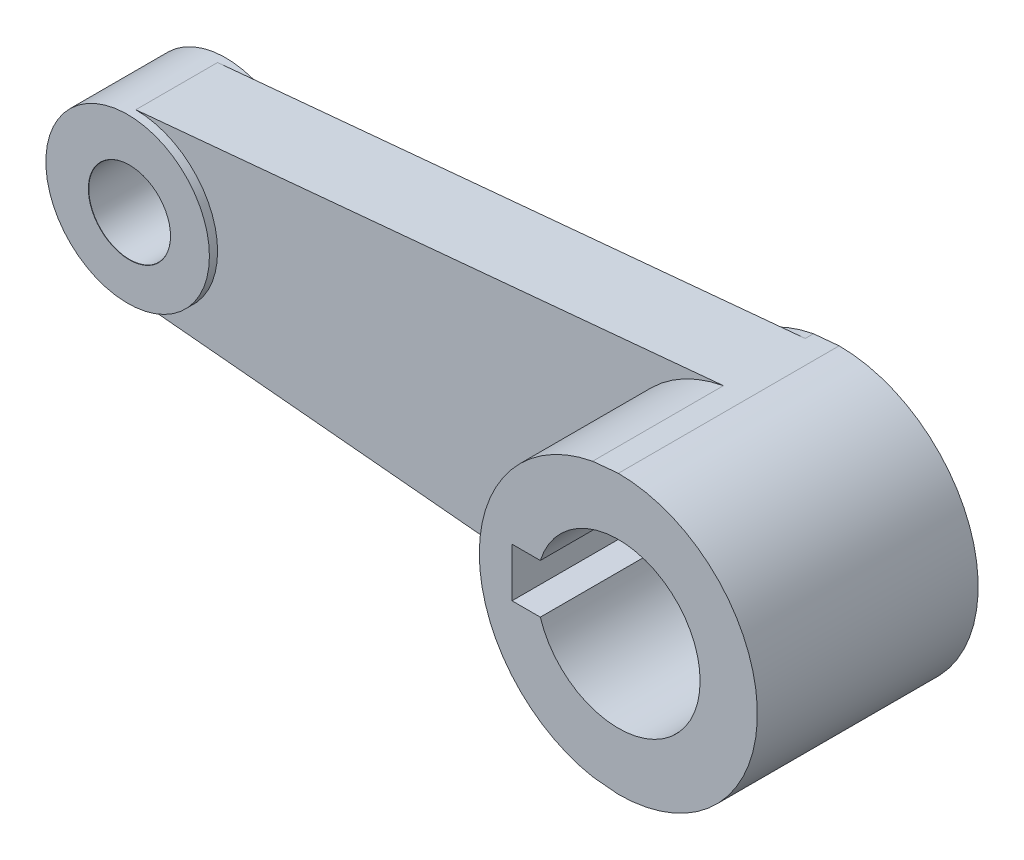
ISO-10303-21;
HEADER;
FILE_DESCRIPTION(('STEP AP214'),'2;1');
FILE_NAME('part.step','',(''),(''),'','','');
FILE_SCHEMA(('AUTOMOTIVE_DESIGN { 1 0 10303 214 1 1 1 1 }'));
ENDSEC;
DATA;
#1=APPLICATION_CONTEXT('core data for automotive mechanical design processes');
#2=APPLICATION_PROTOCOL_DEFINITION('international standard','automotive_design',2000,#1);
#3=PRODUCT_CONTEXT('',#1,'mechanical');
#4=PRODUCT('Part','Part','',(#3));
#5=PRODUCT_RELATED_PRODUCT_CATEGORY('part','',(#4));
#6=PRODUCT_DEFINITION_FORMATION('','',#4);
#7=PRODUCT_DEFINITION_CONTEXT('part definition',#1,'design');
#8=PRODUCT_DEFINITION('design','',#6,#7);
#9=PRODUCT_DEFINITION_SHAPE('','',#8);
#10=(LENGTH_UNIT() NAMED_UNIT(*) SI_UNIT(.MILLI.,.METRE.));
#11=(NAMED_UNIT(*) PLANE_ANGLE_UNIT() SI_UNIT($,.RADIAN.));
#12=(NAMED_UNIT(*) SI_UNIT($,.STERADIAN.) SOLID_ANGLE_UNIT());
#13=UNCERTAINTY_MEASURE_WITH_UNIT(LENGTH_MEASURE(1.E-05),#10,'distance_accuracy_value','');
#14=(GEOMETRIC_REPRESENTATION_CONTEXT(3) GLOBAL_UNCERTAINTY_ASSIGNED_CONTEXT((#13)) GLOBAL_UNIT_ASSIGNED_CONTEXT((#10,
#11,#12)) REPRESENTATION_CONTEXT('',''));
#15=CARTESIAN_POINT('',(0.,0.,0.));
#16=DIRECTION('',(0.,0.,1.));
#17=DIRECTION('',(1.,0.,0.));
#18=AXIS2_PLACEMENT_3D('',#15,#16,#17);
#19=CARTESIAN_POINT('',(-1.57296439901304,16.8531899894255,5.));
#20=DIRECTION('',(0.092929451601597,-0.995672695731397,0.));
#21=DIRECTION('',(0.995672695731397,0.092929451601597,0.));
#22=AXIS2_PLACEMENT_3D('',#19,#20,#21);
#23=PLANE('',#22);
#24=DIRECTION('',(-0.995672695731397,-0.092929451601597,0.));
#25=VECTOR('',#24,1.);
#26=CARTESIAN_POINT('',(-1.57296439901304,16.8531899894255,-5.));
#27=LINE('',#26,#25);
#28=CARTESIAN_POINT('',(-3.14592879802602,16.7063799788509,-5.));
#29=VERTEX_POINT('',#28);
#30=CARTESIAN_POINT('',(-75.,10.,-5.));
#31=VERTEX_POINT('',#30);
#32=EDGE_CURVE('E223',#29,#31,#27,.T.);
#33=ORIENTED_EDGE('',*,*,#32,.T.);
#34=DIRECTION('',(0.,0.,-1.));
#35=VECTOR('',#34,1.);
#36=CARTESIAN_POINT('',(-75.,10.,5.));
#37=LINE('',#36,#35);
#38=CARTESIAN_POINT('',(-75.,10.,5.));
#39=VERTEX_POINT('',#38);
#40=EDGE_CURVE('E11',#39,#31,#37,.T.);
#41=ORIENTED_EDGE('',*,*,#40,.F.);
#42=DIRECTION('',(-0.995672695731397,-0.092929451601597,0.));
#43=VECTOR('',#42,1.);
#44=CARTESIAN_POINT('',(-1.57296439901304,16.8531899894255,5.));
#45=LINE('',#44,#43);
#46=CARTESIAN_POINT('',(-3.14592879802602,16.7063799788509,5.));
#47=VERTEX_POINT('',#46);
#48=EDGE_CURVE('E212',#47,#39,#45,.T.);
#49=ORIENTED_EDGE('',*,*,#48,.F.);
#50=DIRECTION('',(0.,0.,-1.));
#51=VECTOR('',#50,1.);
#52=CARTESIAN_POINT('',(-3.14592879802602,16.7063799788509,21.));
#53=LINE('',#52,#51);
#54=CARTESIAN_POINT('',(-3.14592879802602,16.7063799788509,21.));
#55=VERTEX_POINT('',#54);
#56=EDGE_CURVE('E196',#55,#47,#53,.T.);
#57=ORIENTED_EDGE('',*,*,#56,.F.);
#58=DIRECTION('',(-0.995672695731397,-0.092929451601597,0.));
#59=VECTOR('',#58,1.);
#60=CARTESIAN_POINT('',(-1.57296439901304,16.8531899894255,21.));
#61=LINE('',#60,#59);
#62=CARTESIAN_POINT('',(0.,17.,21.));
#63=VERTEX_POINT('',#62);
#64=EDGE_CURVE('E166',#63,#55,#61,.T.);
#65=ORIENTED_EDGE('',*,*,#64,.F.);
#66=DIRECTION('',(0.,0.,-1.));
#67=VECTOR('',#66,1.);
#68=CARTESIAN_POINT('',(0.,17.,21.));
#69=LINE('',#68,#67);
#70=CARTESIAN_POINT('',(0.,17.,-6.));
#71=VERTEX_POINT('',#70);
#72=EDGE_CURVE('E140',#63,#71,#69,.T.);
#73=ORIENTED_EDGE('',*,*,#72,.T.);
#74=DIRECTION('',(-0.995672695731397,-0.092929451601597,0.));
#75=VECTOR('',#74,1.);
#76=CARTESIAN_POINT('',(-1.57296439901304,16.8531899894255,-6.));
#77=LINE('',#76,#75);
#78=CARTESIAN_POINT('',(-3.14592879802602,16.7063799788509,-6.));
#79=VERTEX_POINT('',#78);
#80=EDGE_CURVE('E183',#71,#79,#77,.T.);
#81=ORIENTED_EDGE('',*,*,#80,.T.);
#82=EDGE_CURVE('E195',#29,#79,#53,.T.);
#83=ORIENTED_EDGE('',*,*,#82,.F.);
#84=EDGE_LOOP('',(#33,#41,#49,#57,#65,#73,#81,#83));
#85=FACE_BOUND('',#84,.T.);
#86=ADVANCED_FACE('F43',(#85),#23,.F.);
#87=CARTESIAN_POINT('',(-1.57296439901304,-16.8531899894255,5.));
#88=DIRECTION('',(0.0929294516015969,0.995672695731397,0.));
#89=DIRECTION('',(-0.995672695731397,0.0929294516015969,0.));
#90=AXIS2_PLACEMENT_3D('',#87,#88,#89);
#91=PLANE('',#90);
#92=DIRECTION('',(0.995672695731397,-0.092929451601597,0.));
#93=VECTOR('',#92,1.);
#94=CARTESIAN_POINT('',(-1.57296439901304,-16.8531899894255,-5.));
#95=LINE('',#94,#93);
#96=CARTESIAN_POINT('',(-75.0000000000001,-10.,-5.));
#97=VERTEX_POINT('',#96);
#98=CARTESIAN_POINT('',(-3.14592879802602,-16.7063799788509,-5.));
#99=VERTEX_POINT('',#98);
#100=EDGE_CURVE('E213',#97,#99,#95,.T.);
#101=ORIENTED_EDGE('',*,*,#100,.T.);
#102=DIRECTION('',(0.,0.,-1.));
#103=VECTOR('',#102,1.);
#104=CARTESIAN_POINT('',(-3.14592879802602,-16.7063799788509,21.));
#105=LINE('',#104,#103);
#106=CARTESIAN_POINT('',(-3.14592879802602,-16.7063799788509,-6.));
#107=VERTEX_POINT('',#106);
#108=EDGE_CURVE('E57',#99,#107,#105,.T.);
#109=ORIENTED_EDGE('',*,*,#108,.T.);
#110=DIRECTION('',(0.995672695731397,-0.092929451601597,0.));
#111=VECTOR('',#110,1.);
#112=CARTESIAN_POINT('',(-1.57296439901304,-16.8531899894255,-6.));
#113=LINE('',#112,#111);
#114=CARTESIAN_POINT('',(0.,-17.,-6.));
#115=VERTEX_POINT('',#114);
#116=EDGE_CURVE('E157',#107,#115,#113,.T.);
#117=ORIENTED_EDGE('',*,*,#116,.T.);
#118=DIRECTION('',(0.,0.,-1.));
#119=VECTOR('',#118,1.);
#120=CARTESIAN_POINT('',(0.,-17.,21.));
#121=LINE('',#120,#119);
#122=CARTESIAN_POINT('',(0.,-17.,21.));
#123=VERTEX_POINT('',#122);
#124=EDGE_CURVE('E189',#123,#115,#121,.T.);
#125=ORIENTED_EDGE('',*,*,#124,.F.);
#126=DIRECTION('',(0.995672695731397,-0.092929451601597,0.));
#127=VECTOR('',#126,1.);
#128=CARTESIAN_POINT('',(-1.57296439901304,-16.8531899894255,21.));
#129=LINE('',#128,#127);
#130=CARTESIAN_POINT('',(-3.14592879802602,-16.7063799788509,21.));
#131=VERTEX_POINT('',#130);
#132=EDGE_CURVE('E171',#131,#123,#129,.T.);
#133=ORIENTED_EDGE('',*,*,#132,.F.);
#134=CARTESIAN_POINT('',(-3.14592879802602,-16.7063799788509,5.));
#135=VERTEX_POINT('',#134);
#136=EDGE_CURVE('E192',#131,#135,#105,.T.);
#137=ORIENTED_EDGE('',*,*,#136,.T.);
#138=DIRECTION('',(0.995672695731397,-0.092929451601597,0.));
#139=VECTOR('',#138,1.);
#140=CARTESIAN_POINT('',(-1.57296439901304,-16.8531899894255,5.));
#141=LINE('',#140,#139);
#142=CARTESIAN_POINT('',(-75.0000000000001,-10.,5.));
#143=VERTEX_POINT('',#142);
#144=EDGE_CURVE('E218',#143,#135,#141,.T.);
#145=ORIENTED_EDGE('',*,*,#144,.F.);
#146=DIRECTION('',(0.,0.,-1.));
#147=VECTOR('',#146,1.);
#148=CARTESIAN_POINT('',(-75.,-10.,5.));
#149=LINE('',#148,#147);
#150=EDGE_CURVE('E50',#143,#97,#149,.T.);
#151=ORIENTED_EDGE('',*,*,#150,.T.);
#152=EDGE_LOOP('',(#101,#109,#117,#125,#133,#137,#145,#151));
#153=FACE_BOUND('',#152,.T.);
#154=ADVANCED_FACE('F232',(#153),#91,.F.);
#155=CARTESIAN_POINT('',(0.,0.,5.));
#156=DIRECTION('',(0.,0.,1.));
#157=DIRECTION('',(1.,0.,0.));
#158=AXIS2_PLACEMENT_3D('',#155,#156,#157);
#159=PLANE('',#158);
#160=CARTESIAN_POINT('',(0.,0.,5.));
#161=DIRECTION('',(0.,0.,1.));
#162=DIRECTION('',(1.,0.,0.));
#163=AXIS2_PLACEMENT_3D('',#160,#161,#162);
#164=CIRCLE('',#163,17.);
#165=EDGE_CURVE('E210',#47,#135,#164,.T.);
#166=ORIENTED_EDGE('',*,*,#165,.F.);
#167=ORIENTED_EDGE('',*,*,#48,.T.);
#168=CARTESIAN_POINT('',(-75.,0.,5.));
#169=DIRECTION('',(0.,0.,1.));
#170=DIRECTION('',(1.,0.,0.));
#171=AXIS2_PLACEMENT_3D('',#168,#169,#170);
#172=CIRCLE('',#171,10.);
#173=EDGE_CURVE('E216',#143,#39,#172,.T.);
#174=ORIENTED_EDGE('',*,*,#173,.F.);
#175=ORIENTED_EDGE('',*,*,#144,.T.);
#176=EDGE_LOOP('',(#166,#167,#174,#175));
#177=FACE_BOUND('',#176,.T.);
#178=ADVANCED_FACE('F258',(#177),#159,.T.);
#179=CARTESIAN_POINT('',(0.,0.,-5.));
#180=DIRECTION('',(0.,0.,1.));
#181=DIRECTION('',(1.,0.,0.));
#182=AXIS2_PLACEMENT_3D('',#179,#180,#181);
#183=PLANE('',#182);
#184=CARTESIAN_POINT('',(0.,0.,-5.));
#185=DIRECTION('',(0.,0.,1.));
#186=DIRECTION('',(1.,0.,0.));
#187=AXIS2_PLACEMENT_3D('',#184,#185,#186);
#188=CIRCLE('',#187,17.);
#189=EDGE_CURVE('E207',#29,#99,#188,.T.);
#190=ORIENTED_EDGE('',*,*,#189,.T.);
#191=ORIENTED_EDGE('',*,*,#100,.F.);
#192=CARTESIAN_POINT('',(-75.,0.,-5.));
#193=DIRECTION('',(0.,0.,1.));
#194=DIRECTION('',(1.,0.,0.));
#195=AXIS2_PLACEMENT_3D('',#192,#193,#194);
#196=CIRCLE('',#195,10.);
#197=EDGE_CURVE('E225',#97,#31,#196,.T.);
#198=ORIENTED_EDGE('',*,*,#197,.T.);
#199=ORIENTED_EDGE('',*,*,#32,.F.);
#200=EDGE_LOOP('',(#190,#191,#198,#199));
#201=FACE_BOUND('',#200,.T.);
#202=ADVANCED_FACE('F235',(#201),#183,.F.);
#203=CARTESIAN_POINT('',(-75.,0.,6.));
#204=DIRECTION('',(0.,0.,-1.));
#205=DIRECTION('',(-1.,0.,0.));
#206=AXIS2_PLACEMENT_3D('',#203,#204,#205);
#207=CYLINDRICAL_SURFACE('',#206,10.);
#208=ORIENTED_EDGE('',*,*,#173,.T.);
#209=ORIENTED_EDGE('',*,*,#40,.T.);
#210=ORIENTED_EDGE('',*,*,#197,.F.);
#211=ORIENTED_EDGE('',*,*,#150,.F.);
#212=EDGE_LOOP('',(#208,#209,#210,#211));
#213=FACE_BOUND('',#212,.T.);
#214=CARTESIAN_POINT('',(-75.,0.,6.));
#215=DIRECTION('',(0.,0.,1.));
#216=DIRECTION('',(1.,0.,0.));
#217=AXIS2_PLACEMENT_3D('',#214,#215,#216);
#218=CIRCLE('',#217,10.);
#219=CARTESIAN_POINT('',(-65.,0.,6.));
#220=VERTEX_POINT('',#219);
#221=EDGE_CURVE('E204',#220,#220,#218,.T.);
#222=ORIENTED_EDGE('',*,*,#221,.F.);
#223=EDGE_LOOP('',(#222));
#224=FACE_BOUND('',#223,.T.);
#225=CARTESIAN_POINT('',(-75.,0.,-6.));
#226=DIRECTION('',(0.,0.,1.));
#227=DIRECTION('',(1.,0.,0.));
#228=AXIS2_PLACEMENT_3D('',#225,#226,#227);
#229=CIRCLE('',#228,10.);
#230=CARTESIAN_POINT('',(-65.,0.,-6.));
#231=VERTEX_POINT('',#230);
#232=EDGE_CURVE('E198',#231,#231,#229,.T.);
#233=ORIENTED_EDGE('',*,*,#232,.T.);
#234=EDGE_LOOP('',(#233));
#235=FACE_BOUND('',#234,.T.);
#236=ADVANCED_FACE('F260',(#213,#224,#235),#207,.T.);
#237=CARTESIAN_POINT('',(-75.,0.,6.));
#238=DIRECTION('',(0.,0.,1.));
#239=DIRECTION('',(1.,0.,0.));
#240=AXIS2_PLACEMENT_3D('',#237,#238,#239);
#241=PLANE('',#240);
#242=CARTESIAN_POINT('',(-74.7794194588171,-0.26573538121514,6.));
#243=DIRECTION('',(0.,0.,1.));
#244=DIRECTION('',(1.,0.,0.));
#245=AXIS2_PLACEMENT_3D('',#242,#243,#244);
#246=CIRCLE('',#245,5.025);
#247=CARTESIAN_POINT('',(-69.7544194588171,-0.26573538121514,6.));
#248=VERTEX_POINT('',#247);
#249=EDGE_CURVE('E471',#248,#248,#246,.T.);
#250=ORIENTED_EDGE('',*,*,#249,.F.);
#251=EDGE_LOOP('',(#250));
#252=FACE_BOUND('',#251,.T.);
#253=ORIENTED_EDGE('',*,*,#221,.T.);
#254=EDGE_LOOP('',(#253));
#255=FACE_BOUND('',#254,.T.);
#256=ADVANCED_FACE('F263',(#252,#255),#241,.T.);
#257=CARTESIAN_POINT('',(-75.,0.,-6.));
#258=DIRECTION('',(0.,0.,1.));
#259=DIRECTION('',(1.,0.,0.));
#260=AXIS2_PLACEMENT_3D('',#257,#258,#259);
#261=PLANE('',#260);
#262=CARTESIAN_POINT('',(-74.7794194588171,-0.26573538121514,-6.));
#263=DIRECTION('',(0.,0.,1.));
#264=DIRECTION('',(1.,0.,0.));
#265=AXIS2_PLACEMENT_3D('',#262,#263,#264);
#266=CIRCLE('',#265,5.);
#267=CARTESIAN_POINT('',(-69.7794194588171,-0.26573538121514,-6.));
#268=VERTEX_POINT('',#267);
#269=EDGE_CURVE('E161',#268,#268,#266,.T.);
#270=ORIENTED_EDGE('',*,*,#269,.T.);
#271=EDGE_LOOP('',(#270));
#272=FACE_BOUND('',#271,.T.);
#273=ORIENTED_EDGE('',*,*,#232,.F.);
#274=EDGE_LOOP('',(#273));
#275=FACE_BOUND('',#274,.T.);
#276=ADVANCED_FACE('F269',(#272,#275),#261,.F.);
#277=CARTESIAN_POINT('',(0.,0.,21.));
#278=DIRECTION('',(0.,0.,-1.));
#279=DIRECTION('',(-1.,0.,0.));
#280=AXIS2_PLACEMENT_3D('',#277,#278,#279);
#281=CYLINDRICAL_SURFACE('',#280,17.);
#282=ORIENTED_EDGE('',*,*,#108,.F.);
#283=ORIENTED_EDGE('',*,*,#189,.F.);
#284=ORIENTED_EDGE('',*,*,#82,.T.);
#285=CARTESIAN_POINT('',(0.,0.,-6.));
#286=DIRECTION('',(0.,0.,1.));
#287=DIRECTION('',(1.,0.,0.));
#288=AXIS2_PLACEMENT_3D('',#285,#286,#287);
#289=CIRCLE('',#288,17.);
#290=EDGE_CURVE('E159',#79,#107,#289,.T.);
#291=ORIENTED_EDGE('',*,*,#290,.T.);
#292=EDGE_LOOP('',(#282,#283,#284,#291));
#293=FACE_BOUND('',#292,.T.);
#294=ADVANCED_FACE('F238',(#293),#281,.T.);
#295=ORIENTED_EDGE('',*,*,#165,.T.);
#296=ORIENTED_EDGE('',*,*,#136,.F.);
#297=CARTESIAN_POINT('',(0.,0.,21.));
#298=DIRECTION('',(0.,0.,1.));
#299=DIRECTION('',(1.,0.,0.));
#300=AXIS2_PLACEMENT_3D('',#297,#298,#299);
#301=CIRCLE('',#300,17.);
#302=EDGE_CURVE('E169',#55,#131,#301,.T.);
#303=ORIENTED_EDGE('',*,*,#302,.F.);
#304=ORIENTED_EDGE('',*,*,#56,.T.);
#305=EDGE_LOOP('',(#295,#296,#303,#304));
#306=FACE_BOUND('',#305,.T.);
#307=ADVANCED_FACE('F277',(#306),#281,.T.);
#308=CARTESIAN_POINT('',(0.,0.,21.));
#309=DIRECTION('',(0.,0.,-1.));
#310=DIRECTION('',(-1.,0.,0.));
#311=AXIS2_PLACEMENT_3D('',#308,#309,#310);
#312=CYLINDRICAL_SURFACE('',#311,10.);
#313=CARTESIAN_POINT('',(0.,0.,-6.));
#314=DIRECTION('',(0.,0.,1.));
#315=DIRECTION('',(1.,0.,0.));
#316=AXIS2_PLACEMENT_3D('',#313,#314,#315);
#317=CIRCLE('',#316,10.);
#318=CARTESIAN_POINT('',(-9.53939201416946,-3.,-6.));
#319=VERTEX_POINT('',#318);
#320=CARTESIAN_POINT('',(-9.53939201416946,3.,-6.));
#321=VERTEX_POINT('',#320);
#322=EDGE_CURVE('E136',#319,#321,#317,.T.);
#323=ORIENTED_EDGE('',*,*,#322,.F.);
#324=DIRECTION('',(0.,0.,-1.));
#325=VECTOR('',#324,1.);
#326=CARTESIAN_POINT('',(-9.53939201416946,-3.,21.));
#327=LINE('',#326,#325);
#328=CARTESIAN_POINT('',(-9.53939201416946,-3.,21.));
#329=VERTEX_POINT('',#328);
#330=EDGE_CURVE('E129',#329,#319,#327,.T.);
#331=ORIENTED_EDGE('',*,*,#330,.F.);
#332=CARTESIAN_POINT('',(0.,0.,21.));
#333=DIRECTION('',(0.,0.,1.));
#334=DIRECTION('',(1.,0.,0.));
#335=AXIS2_PLACEMENT_3D('',#332,#333,#334);
#336=CIRCLE('',#335,10.);
#337=CARTESIAN_POINT('',(-9.53939201416946,3.,21.));
#338=VERTEX_POINT('',#337);
#339=EDGE_CURVE('E133',#329,#338,#336,.T.);
#340=ORIENTED_EDGE('',*,*,#339,.T.);
#341=DIRECTION('',(0.,0.,-1.));
#342=VECTOR('',#341,1.);
#343=CARTESIAN_POINT('',(-9.53939201416946,3.,21.));
#344=LINE('',#343,#342);
#345=EDGE_CURVE('E199',#338,#321,#344,.T.);
#346=ORIENTED_EDGE('',*,*,#345,.T.);
#347=EDGE_LOOP('',(#323,#331,#340,#346));
#348=FACE_BOUND('',#347,.T.);
#349=ADVANCED_FACE('F131',(#348),#312,.F.);
#350=CARTESIAN_POINT('',(0.,-3.,21.));
#351=DIRECTION('',(0.,-1.,0.));
#352=DIRECTION('',(1.,0.,0.));
#353=AXIS2_PLACEMENT_3D('',#350,#351,#352);
#354=PLANE('',#353);
#355=DIRECTION('',(-1.,0.,0.));
#356=VECTOR('',#355,1.);
#357=CARTESIAN_POINT('',(0.,-3.,-6.));
#358=LINE('',#357,#356);
#359=CARTESIAN_POINT('',(-13.,-3.,-6.));
#360=VERTEX_POINT('',#359);
#361=EDGE_CURVE('E175',#319,#360,#358,.T.);
#362=ORIENTED_EDGE('',*,*,#361,.T.);
#363=DIRECTION('',(0.,0.,-1.));
#364=VECTOR('',#363,1.);
#365=CARTESIAN_POINT('',(-13.,-3.,21.));
#366=LINE('',#365,#364);
#367=CARTESIAN_POINT('',(-13.,-3.,21.));
#368=VERTEX_POINT('',#367);
#369=EDGE_CURVE('E141',#368,#360,#366,.T.);
#370=ORIENTED_EDGE('',*,*,#369,.F.);
#371=DIRECTION('',(-1.,0.,0.));
#372=VECTOR('',#371,1.);
#373=CARTESIAN_POINT('',(0.,-3.,21.));
#374=LINE('',#373,#372);
#375=EDGE_CURVE('E144',#329,#368,#374,.T.);
#376=ORIENTED_EDGE('',*,*,#375,.F.);
#377=ORIENTED_EDGE('',*,*,#330,.T.);
#378=EDGE_LOOP('',(#362,#370,#376,#377));
#379=FACE_BOUND('',#378,.T.);
#380=ADVANCED_FACE('F145',(#379),#354,.F.);
#381=CARTESIAN_POINT('',(-13.,0.,21.));
#382=DIRECTION('',(1.,0.,0.));
#383=DIRECTION('',(0.,0.,-1.));
#384=AXIS2_PLACEMENT_3D('',#381,#382,#383);
#385=PLANE('',#384);
#386=DIRECTION('',(0.,-1.,0.));
#387=VECTOR('',#386,1.);
#388=CARTESIAN_POINT('',(-13.,0.,-6.));
#389=LINE('',#388,#387);
#390=CARTESIAN_POINT('',(-13.,3.,-6.));
#391=VERTEX_POINT('',#390);
#392=EDGE_CURVE('E177',#391,#360,#389,.T.);
#393=ORIENTED_EDGE('',*,*,#392,.F.);
#394=DIRECTION('',(0.,0.,-1.));
#395=VECTOR('',#394,1.);
#396=CARTESIAN_POINT('',(-13.,3.,21.));
#397=LINE('',#396,#395);
#398=CARTESIAN_POINT('',(-13.,3.,21.));
#399=VERTEX_POINT('',#398);
#400=EDGE_CURVE('E201',#399,#391,#397,.T.);
#401=ORIENTED_EDGE('',*,*,#400,.F.);
#402=DIRECTION('',(0.,-1.,0.));
#403=VECTOR('',#402,1.);
#404=CARTESIAN_POINT('',(-13.,0.,21.));
#405=LINE('',#404,#403);
#406=EDGE_CURVE('E149',#399,#368,#405,.T.);
#407=ORIENTED_EDGE('',*,*,#406,.T.);
#408=ORIENTED_EDGE('',*,*,#369,.T.);
#409=EDGE_LOOP('',(#393,#401,#407,#408));
#410=FACE_BOUND('',#409,.T.);
#411=ADVANCED_FACE('F371',(#410),#385,.T.);
#412=CARTESIAN_POINT('',(0.,3.,21.));
#413=DIRECTION('',(0.,-1.,0.));
#414=DIRECTION('',(0.,0.,-1.));
#415=AXIS2_PLACEMENT_3D('',#412,#413,#414);
#416=PLANE('',#415);
#417=DIRECTION('',(-1.,0.,0.));
#418=VECTOR('',#417,1.);
#419=CARTESIAN_POINT('',(0.,3.,-6.));
#420=LINE('',#419,#418);
#421=EDGE_CURVE('E180',#321,#391,#420,.T.);
#422=ORIENTED_EDGE('',*,*,#421,.F.);
#423=ORIENTED_EDGE('',*,*,#345,.F.);
#424=DIRECTION('',(-1.,0.,0.));
#425=VECTOR('',#424,1.);
#426=CARTESIAN_POINT('',(0.,3.,21.));
#427=LINE('',#426,#425);
#428=EDGE_CURVE('E154',#338,#399,#427,.T.);
#429=ORIENTED_EDGE('',*,*,#428,.T.);
#430=ORIENTED_EDGE('',*,*,#400,.T.);
#431=EDGE_LOOP('',(#422,#423,#429,#430));
#432=FACE_BOUND('',#431,.T.);
#433=ADVANCED_FACE('F363',(#432),#416,.T.);
#434=EDGE_CURVE('E155',#115,#71,#289,.T.);
#435=ORIENTED_EDGE('',*,*,#434,.T.);
#436=ORIENTED_EDGE('',*,*,#72,.F.);
#437=EDGE_CURVE('E172',#123,#63,#301,.T.);
#438=ORIENTED_EDGE('',*,*,#437,.F.);
#439=ORIENTED_EDGE('',*,*,#124,.T.);
#440=EDGE_LOOP('',(#435,#436,#438,#439));
#441=FACE_BOUND('',#440,.T.);
#442=ADVANCED_FACE('F252',(#441),#281,.T.);
#443=CARTESIAN_POINT('',(0.,0.,21.));
#444=DIRECTION('',(0.,0.,1.));
#445=DIRECTION('',(1.,0.,0.));
#446=AXIS2_PLACEMENT_3D('',#443,#444,#445);
#447=PLANE('',#446);
#448=ORIENTED_EDGE('',*,*,#339,.F.);
#449=ORIENTED_EDGE('',*,*,#375,.T.);
#450=ORIENTED_EDGE('',*,*,#406,.F.);
#451=ORIENTED_EDGE('',*,*,#428,.F.);
#452=EDGE_LOOP('',(#448,#449,#450,#451));
#453=FACE_BOUND('',#452,.T.);
#454=ORIENTED_EDGE('',*,*,#64,.T.);
#455=ORIENTED_EDGE('',*,*,#302,.T.);
#456=ORIENTED_EDGE('',*,*,#132,.T.);
#457=ORIENTED_EDGE('',*,*,#437,.T.);
#458=EDGE_LOOP('',(#454,#455,#456,#457));
#459=FACE_BOUND('',#458,.T.);
#460=ADVANCED_FACE('F151',(#453,#459),#447,.T.);
#461=CARTESIAN_POINT('',(0.,0.,-6.));
#462=DIRECTION('',(0.,0.,1.));
#463=DIRECTION('',(1.,0.,0.));
#464=AXIS2_PLACEMENT_3D('',#461,#462,#463);
#465=PLANE('',#464);
#466=ORIENTED_EDGE('',*,*,#322,.T.);
#467=ORIENTED_EDGE('',*,*,#421,.T.);
#468=ORIENTED_EDGE('',*,*,#392,.T.);
#469=ORIENTED_EDGE('',*,*,#361,.F.);
#470=EDGE_LOOP('',(#466,#467,#468,#469));
#471=FACE_BOUND('',#470,.T.);
#472=ORIENTED_EDGE('',*,*,#80,.F.);
#473=ORIENTED_EDGE('',*,*,#434,.F.);
#474=ORIENTED_EDGE('',*,*,#116,.F.);
#475=ORIENTED_EDGE('',*,*,#290,.F.);
#476=EDGE_LOOP('',(#472,#473,#474,#475));
#477=FACE_BOUND('',#476,.T.);
#478=ADVANCED_FACE('F246',(#471,#477),#465,.F.);
#479=CARTESIAN_POINT('',(-74.7794194588171,-0.26573538121514,6.));
#480=DIRECTION('',(0.,0.,1.));
#481=DIRECTION('',(1.,0.,0.));
#482=AXIS2_PLACEMENT_3D('',#479,#480,#481);
#483=CYLINDRICAL_SURFACE('',#482,5.);
#484=ORIENTED_EDGE('',*,*,#269,.F.);
#485=EDGE_LOOP('',(#484));
#486=FACE_BOUND('',#485,.T.);
#487=CARTESIAN_POINT('',(-74.7794194588171,-0.26573538121514,5.975));
#488=DIRECTION('',(0.,0.,1.));
#489=DIRECTION('',(1.,0.,0.));
#490=AXIS2_PLACEMENT_3D('',#487,#488,#489);
#491=CIRCLE('',#490,5.);
#492=CARTESIAN_POINT('',(-69.7794194588171,-0.26573538121514,5.975));
#493=VERTEX_POINT('',#492);
#494=EDGE_CURVE('E468',#493,#493,#491,.T.);
#495=ORIENTED_EDGE('',*,*,#494,.T.);
#496=EDGE_LOOP('',(#495));
#497=FACE_BOUND('',#496,.T.);
#498=ADVANCED_FACE('F322',(#486,#497),#483,.F.);
#499=CARTESIAN_POINT('',(-74.7794194588171,-0.26573538121514,6.));
#500=DIRECTION('',(0.,0.,1.));
#501=DIRECTION('',(1.,0.,0.));
#502=AXIS2_PLACEMENT_3D('',#499,#500,#501);
#503=CONICAL_SURFACE('',#502,5.025,0.785398163397379);
#504=ORIENTED_EDGE('',*,*,#494,.F.);
#505=EDGE_LOOP('',(#504));
#506=FACE_BOUND('',#505,.T.);
#507=ORIENTED_EDGE('',*,*,#249,.T.);
#508=EDGE_LOOP('',(#507));
#509=FACE_BOUND('',#508,.T.);
#510=ADVANCED_FACE('F327',(#506,#509),#503,.F.);
#511=CLOSED_SHELL('',(#86,#154,#178,#202,#236,#256,#276,#294,#307,#349,#380,#411,#433,#442,#460,
#478,#498,#510));
#512=MANIFOLD_SOLID_BREP('B2',#511);
#513=ADVANCED_BREP_SHAPE_REPRESENTATION('',(#18,#512),#14);
#514=SHAPE_DEFINITION_REPRESENTATION(#9,#513);
ENDSEC;
END-ISO-10303-21;
